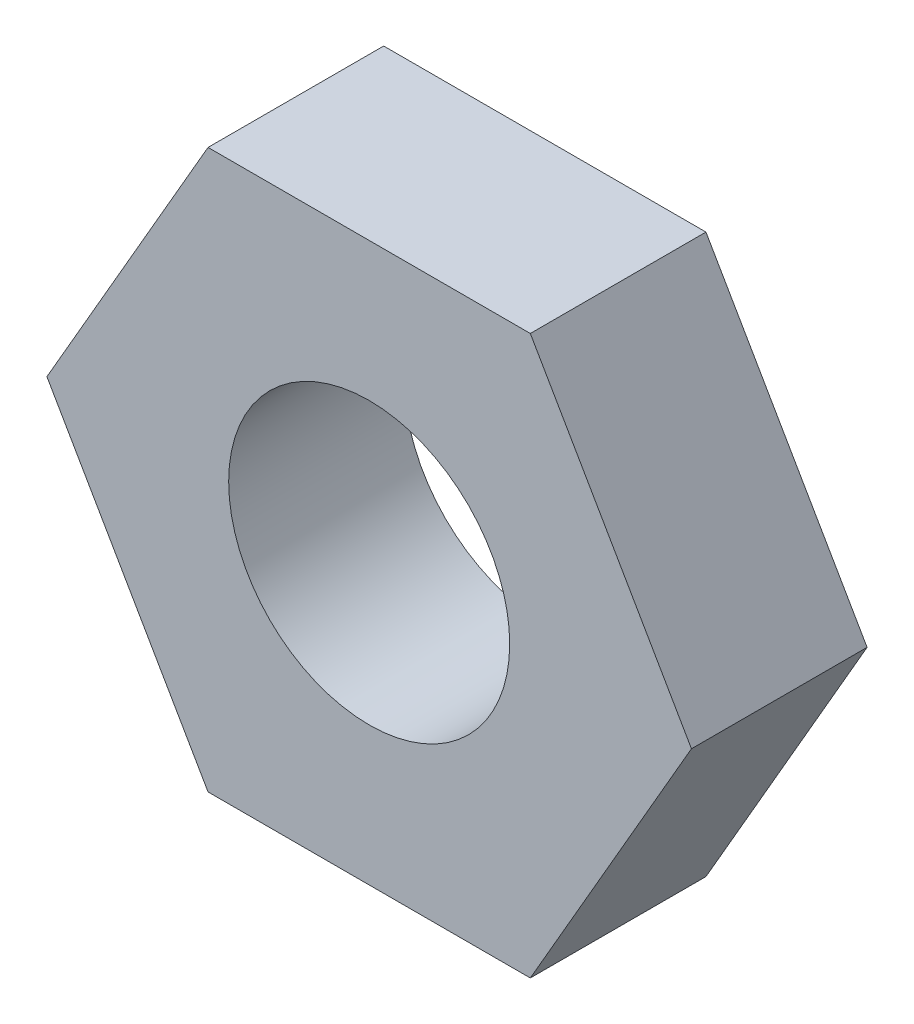
ISO-10303-21;
HEADER;
FILE_DESCRIPTION(('STEP AP214'),'2;1');
FILE_NAME('part.step','',(''),(''),'','','');
FILE_SCHEMA(('AUTOMOTIVE_DESIGN { 1 0 10303 214 1 1 1 1 }'));
ENDSEC;
DATA;
#1=APPLICATION_CONTEXT('core data for automotive mechanical design processes');
#2=APPLICATION_PROTOCOL_DEFINITION('international standard','automotive_design',2000,#1);
#3=PRODUCT_CONTEXT('',#1,'mechanical');
#4=PRODUCT('Part','Part','',(#3));
#5=PRODUCT_RELATED_PRODUCT_CATEGORY('part','',(#4));
#6=PRODUCT_DEFINITION_FORMATION('','',#4);
#7=PRODUCT_DEFINITION_CONTEXT('part definition',#1,'design');
#8=PRODUCT_DEFINITION('design','',#6,#7);
#9=PRODUCT_DEFINITION_SHAPE('','',#8);
#10=(LENGTH_UNIT() NAMED_UNIT(*) SI_UNIT(.MILLI.,.METRE.));
#11=(NAMED_UNIT(*) PLANE_ANGLE_UNIT() SI_UNIT($,.RADIAN.));
#12=(NAMED_UNIT(*) SI_UNIT($,.STERADIAN.) SOLID_ANGLE_UNIT());
#13=UNCERTAINTY_MEASURE_WITH_UNIT(LENGTH_MEASURE(1.E-05),#10,'distance_accuracy_value','');
#14=(GEOMETRIC_REPRESENTATION_CONTEXT(3) GLOBAL_UNCERTAINTY_ASSIGNED_CONTEXT((#13)) GLOBAL_UNIT_ASSIGNED_CONTEXT((#10,
#11,#12)) REPRESENTATION_CONTEXT('',''));
#15=CARTESIAN_POINT('',(0.,0.,0.));
#16=DIRECTION('',(0.,0.,1.));
#17=DIRECTION('',(1.,0.,0.));
#18=AXIS2_PLACEMENT_3D('',#15,#16,#17);
#19=CARTESIAN_POINT('',(0.,0.,5.));
#20=DIRECTION('',(0.,0.,1.));
#21=DIRECTION('',(1.,0.,0.));
#22=AXIS2_PLACEMENT_3D('',#19,#20,#21);
#23=PLANE('',#22);
#24=DIRECTION('',(-1.,0.,0.));
#25=VECTOR('',#24,1.);
#26=CARTESIAN_POINT('',(0.,7.945,5.));
#27=LINE('',#26,#25);
#28=CARTESIAN_POINT('',(4.58704788871157,7.945,5.));
#29=VERTEX_POINT('',#28);
#30=CARTESIAN_POINT('',(-4.58704788871158,7.945,5.));
#31=VERTEX_POINT('',#30);
#32=EDGE_CURVE('E137',#29,#31,#27,.T.);
#33=ORIENTED_EDGE('',*,*,#32,.T.);
#34=DIRECTION('',(-0.499999999999999,-0.866025403784439,0.));
#35=VECTOR('',#34,1.);
#36=CARTESIAN_POINT('',(-4.58704788871158,7.945,5.));
#37=LINE('',#36,#35);
#38=CARTESIAN_POINT('',(-9.17409577742316,0.,5.));
#39=VERTEX_POINT('',#38);
#40=EDGE_CURVE('E89',#31,#39,#37,.T.);
#41=ORIENTED_EDGE('',*,*,#40,.T.);
#42=DIRECTION('',(0.500000000000001,-0.866025403784438,0.));
#43=VECTOR('',#42,1.);
#44=CARTESIAN_POINT('',(-9.17409577742316,0.,5.));
#45=LINE('',#44,#43);
#46=CARTESIAN_POINT('',(-4.58704788871157,-7.945,5.));
#47=VERTEX_POINT('',#46);
#48=EDGE_CURVE('E103',#39,#47,#45,.T.);
#49=ORIENTED_EDGE('',*,*,#48,.T.);
#50=DIRECTION('',(1.,0.,0.));
#51=VECTOR('',#50,1.);
#52=CARTESIAN_POINT('',(-4.58704788871157,-7.945,5.));
#53=LINE('',#52,#51);
#54=CARTESIAN_POINT('',(4.58704788871159,-7.945,5.));
#55=VERTEX_POINT('',#54);
#56=EDGE_CURVE('E96',#47,#55,#53,.T.);
#57=ORIENTED_EDGE('',*,*,#56,.T.);
#58=DIRECTION('',(0.499999999999999,0.866025403784439,0.));
#59=VECTOR('',#58,1.);
#60=CARTESIAN_POINT('',(4.58704788871159,-7.945,5.));
#61=LINE('',#60,#59);
#62=CARTESIAN_POINT('',(9.17409577742315,0.,5.));
#63=VERTEX_POINT('',#62);
#64=EDGE_CURVE('E100',#55,#63,#61,.T.);
#65=ORIENTED_EDGE('',*,*,#64,.T.);
#66=DIRECTION('',(-0.500000000000001,0.866025403784438,0.));
#67=VECTOR('',#66,1.);
#68=CARTESIAN_POINT('',(9.17409577742315,0.,5.));
#69=LINE('',#68,#67);
#70=EDGE_CURVE('E54',#63,#29,#69,.T.);
#71=ORIENTED_EDGE('',*,*,#70,.T.);
#72=EDGE_LOOP('',(#33,#41,#49,#57,#65,#71));
#73=FACE_BOUND('',#72,.T.);
#74=CARTESIAN_POINT('',(0.,0.,5.));
#75=DIRECTION('',(0.,0.,1.));
#76=DIRECTION('',(1.,0.,0.));
#77=AXIS2_PLACEMENT_3D('',#74,#75,#76);
#78=CIRCLE('',#77,4.);
#79=CARTESIAN_POINT('',(4.,0.,5.));
#80=VERTEX_POINT('',#79);
#81=EDGE_CURVE('E127',#80,#80,#78,.T.);
#82=ORIENTED_EDGE('',*,*,#81,.F.);
#83=EDGE_LOOP('',(#82));
#84=FACE_BOUND('',#83,.T.);
#85=ADVANCED_FACE('F37',(#73,#84),#23,.T.);
#86=CARTESIAN_POINT('',(0.,0.,0.));
#87=DIRECTION('',(0.,0.,1.));
#88=DIRECTION('',(1.,0.,0.));
#89=AXIS2_PLACEMENT_3D('',#86,#87,#88);
#90=PLANE('',#89);
#91=DIRECTION('',(-0.499999999999999,-0.866025403784439,0.));
#92=VECTOR('',#91,1.);
#93=CARTESIAN_POINT('',(-6.88057183306737,3.9725,0.));
#94=LINE('',#93,#92);
#95=CARTESIAN_POINT('',(-4.58704788871158,7.945,0.));
#96=VERTEX_POINT('',#95);
#97=CARTESIAN_POINT('',(-9.17409577742316,0.,0.));
#98=VERTEX_POINT('',#97);
#99=EDGE_CURVE('E123',#96,#98,#94,.T.);
#100=ORIENTED_EDGE('',*,*,#99,.F.);
#101=DIRECTION('',(-1.,0.,0.));
#102=VECTOR('',#101,1.);
#103=CARTESIAN_POINT('',(4.58704788871157,7.945,0.));
#104=LINE('',#103,#102);
#105=CARTESIAN_POINT('',(4.58704788871157,7.945,0.));
#106=VERTEX_POINT('',#105);
#107=EDGE_CURVE('E134',#106,#96,#104,.T.);
#108=ORIENTED_EDGE('',*,*,#107,.F.);
#109=DIRECTION('',(-0.500000000000001,0.866025403784438,0.));
#110=VECTOR('',#109,1.);
#111=CARTESIAN_POINT('',(6.88057183306736,3.97250000000001,0.));
#112=LINE('',#111,#110);
#113=CARTESIAN_POINT('',(9.17409577742315,0.,0.));
#114=VERTEX_POINT('',#113);
#115=EDGE_CURVE('E76',#114,#106,#112,.T.);
#116=ORIENTED_EDGE('',*,*,#115,.F.);
#117=DIRECTION('',(0.499999999999999,0.866025403784439,0.));
#118=VECTOR('',#117,1.);
#119=CARTESIAN_POINT('',(6.88057183306737,-3.97249999999999,0.));
#120=LINE('',#119,#118);
#121=CARTESIAN_POINT('',(4.58704788871159,-7.945,0.));
#122=VERTEX_POINT('',#121);
#123=EDGE_CURVE('E131',#122,#114,#120,.T.);
#124=ORIENTED_EDGE('',*,*,#123,.F.);
#125=DIRECTION('',(1.,0.,0.));
#126=VECTOR('',#125,1.);
#127=CARTESIAN_POINT('',(0.,-7.945,0.));
#128=LINE('',#127,#126);
#129=CARTESIAN_POINT('',(-4.58704788871157,-7.945,0.));
#130=VERTEX_POINT('',#129);
#131=EDGE_CURVE('E112',#130,#122,#128,.T.);
#132=ORIENTED_EDGE('',*,*,#131,.F.);
#133=DIRECTION('',(0.500000000000001,-0.866025403784438,0.));
#134=VECTOR('',#133,1.);
#135=CARTESIAN_POINT('',(-6.88057183306736,-3.97250000000001,0.));
#136=LINE('',#135,#134);
#137=EDGE_CURVE('E126',#98,#130,#136,.T.);
#138=ORIENTED_EDGE('',*,*,#137,.F.);
#139=EDGE_LOOP('',(#100,#108,#116,#124,#132,#138));
#140=FACE_BOUND('',#139,.T.);
#141=CARTESIAN_POINT('',(0.,0.,0.));
#142=DIRECTION('',(0.,0.,1.));
#143=DIRECTION('',(1.,0.,0.));
#144=AXIS2_PLACEMENT_3D('',#141,#142,#143);
#145=CIRCLE('',#144,4.);
#146=CARTESIAN_POINT('',(4.,0.,0.));
#147=VERTEX_POINT('',#146);
#148=EDGE_CURVE('E174',#147,#147,#145,.T.);
#149=ORIENTED_EDGE('',*,*,#148,.T.);
#150=EDGE_LOOP('',(#149));
#151=FACE_BOUND('',#150,.T.);
#152=ADVANCED_FACE('F144',(#140,#151),#90,.F.);
#153=CARTESIAN_POINT('',(-6.88057183306737,3.9725,5.));
#154=DIRECTION('',(0.866025403784439,-0.499999999999999,0.));
#155=DIRECTION('',(0.499999999999999,0.866025403784439,0.));
#156=AXIS2_PLACEMENT_3D('',#153,#154,#155);
#157=PLANE('',#156);
#158=ORIENTED_EDGE('',*,*,#99,.T.);
#159=DIRECTION('',(0.,0.,-1.));
#160=VECTOR('',#159,1.);
#161=CARTESIAN_POINT('',(-9.17409577742316,0.,5.));
#162=LINE('',#161,#160);
#163=EDGE_CURVE('E46',#39,#98,#162,.T.);
#164=ORIENTED_EDGE('',*,*,#163,.F.);
#165=ORIENTED_EDGE('',*,*,#40,.F.);
#166=DIRECTION('',(0.,0.,-1.));
#167=VECTOR('',#166,1.);
#168=CARTESIAN_POINT('',(-4.58704788871158,7.945,5.));
#169=LINE('',#168,#167);
#170=EDGE_CURVE('E11',#31,#96,#169,.T.);
#171=ORIENTED_EDGE('',*,*,#170,.T.);
#172=EDGE_LOOP('',(#158,#164,#165,#171));
#173=FACE_BOUND('',#172,.T.);
#174=ADVANCED_FACE('F39',(#173),#157,.F.);
#175=CARTESIAN_POINT('',(-6.88057183306736,-3.97250000000001,5.));
#176=DIRECTION('',(0.866025403784438,0.500000000000001,0.));
#177=DIRECTION('',(-0.500000000000001,0.866025403784438,0.));
#178=AXIS2_PLACEMENT_3D('',#175,#176,#177);
#179=PLANE('',#178);
#180=ORIENTED_EDGE('',*,*,#137,.T.);
#181=DIRECTION('',(0.,0.,-1.));
#182=VECTOR('',#181,1.);
#183=CARTESIAN_POINT('',(-4.58704788871157,-7.945,5.));
#184=LINE('',#183,#182);
#185=EDGE_CURVE('E114',#47,#130,#184,.T.);
#186=ORIENTED_EDGE('',*,*,#185,.F.);
#187=ORIENTED_EDGE('',*,*,#48,.F.);
#188=ORIENTED_EDGE('',*,*,#163,.T.);
#189=EDGE_LOOP('',(#180,#186,#187,#188));
#190=FACE_BOUND('',#189,.T.);
#191=ADVANCED_FACE('F142',(#190),#179,.F.);
#192=CARTESIAN_POINT('',(0.,-7.945,5.));
#193=DIRECTION('',(0.,1.,0.));
#194=DIRECTION('',(-1.,0.,0.));
#195=AXIS2_PLACEMENT_3D('',#192,#193,#194);
#196=PLANE('',#195);
#197=ORIENTED_EDGE('',*,*,#131,.T.);
#198=DIRECTION('',(0.,0.,-1.));
#199=VECTOR('',#198,1.);
#200=CARTESIAN_POINT('',(4.58704788871159,-7.945,5.));
#201=LINE('',#200,#199);
#202=EDGE_CURVE('E110',#55,#122,#201,.T.);
#203=ORIENTED_EDGE('',*,*,#202,.F.);
#204=ORIENTED_EDGE('',*,*,#56,.F.);
#205=ORIENTED_EDGE('',*,*,#185,.T.);
#206=EDGE_LOOP('',(#197,#203,#204,#205));
#207=FACE_BOUND('',#206,.T.);
#208=ADVANCED_FACE('F111',(#207),#196,.F.);
#209=CARTESIAN_POINT('',(6.88057183306737,-3.97249999999999,5.));
#210=DIRECTION('',(-0.866025403784439,0.499999999999999,0.));
#211=DIRECTION('',(-0.499999999999999,-0.866025403784439,0.));
#212=AXIS2_PLACEMENT_3D('',#209,#210,#211);
#213=PLANE('',#212);
#214=ORIENTED_EDGE('',*,*,#123,.T.);
#215=DIRECTION('',(0.,0.,-1.));
#216=VECTOR('',#215,1.);
#217=CARTESIAN_POINT('',(9.17409577742315,0.,5.));
#218=LINE('',#217,#216);
#219=EDGE_CURVE('E115',#63,#114,#218,.T.);
#220=ORIENTED_EDGE('',*,*,#219,.F.);
#221=ORIENTED_EDGE('',*,*,#64,.F.);
#222=ORIENTED_EDGE('',*,*,#202,.T.);
#223=EDGE_LOOP('',(#214,#220,#221,#222));
#224=FACE_BOUND('',#223,.T.);
#225=ADVANCED_FACE('F117',(#224),#213,.F.);
#226=CARTESIAN_POINT('',(6.88057183306736,3.97250000000001,5.));
#227=DIRECTION('',(-0.866025403784438,-0.500000000000001,0.));
#228=DIRECTION('',(0.500000000000001,-0.866025403784438,0.));
#229=AXIS2_PLACEMENT_3D('',#226,#227,#228);
#230=PLANE('',#229);
#231=ORIENTED_EDGE('',*,*,#115,.T.);
#232=DIRECTION('',(0.,0.,-1.));
#233=VECTOR('',#232,1.);
#234=CARTESIAN_POINT('',(4.58704788871157,7.945,5.));
#235=LINE('',#234,#233);
#236=EDGE_CURVE('E119',#29,#106,#235,.T.);
#237=ORIENTED_EDGE('',*,*,#236,.F.);
#238=ORIENTED_EDGE('',*,*,#70,.F.);
#239=ORIENTED_EDGE('',*,*,#219,.T.);
#240=EDGE_LOOP('',(#231,#237,#238,#239));
#241=FACE_BOUND('',#240,.T.);
#242=ADVANCED_FACE('F148',(#241),#230,.F.);
#243=CARTESIAN_POINT('',(4.58704788871157,7.945,5.));
#244=DIRECTION('',(0.,-1.,0.));
#245=DIRECTION('',(1.,0.,0.));
#246=AXIS2_PLACEMENT_3D('',#243,#244,#245);
#247=PLANE('',#246);
#248=ORIENTED_EDGE('',*,*,#107,.T.);
#249=ORIENTED_EDGE('',*,*,#170,.F.);
#250=ORIENTED_EDGE('',*,*,#32,.F.);
#251=ORIENTED_EDGE('',*,*,#236,.T.);
#252=EDGE_LOOP('',(#248,#249,#250,#251));
#253=FACE_BOUND('',#252,.T.);
#254=ADVANCED_FACE('F147',(#253),#247,.F.);
#255=CARTESIAN_POINT('',(0.,0.,5.));
#256=DIRECTION('',(0.,0.,-1.));
#257=DIRECTION('',(-1.,0.,0.));
#258=AXIS2_PLACEMENT_3D('',#255,#256,#257);
#259=CYLINDRICAL_SURFACE('',#258,4.);
#260=ORIENTED_EDGE('',*,*,#81,.T.);
#261=EDGE_LOOP('',(#260));
#262=FACE_BOUND('',#261,.T.);
#263=ORIENTED_EDGE('',*,*,#148,.F.);
#264=EDGE_LOOP('',(#263));
#265=FACE_BOUND('',#264,.T.);
#266=ADVANCED_FACE('F155',(#262,#265),#259,.F.);
#267=CLOSED_SHELL('',(#85,#152,#174,#191,#208,#225,#242,#254,#266));
#268=MANIFOLD_SOLID_BREP('B2',#267);
#269=ADVANCED_BREP_SHAPE_REPRESENTATION('',(#18,#268),#14);
#270=SHAPE_DEFINITION_REPRESENTATION(#9,#269);
ENDSEC;
END-ISO-10303-21;
